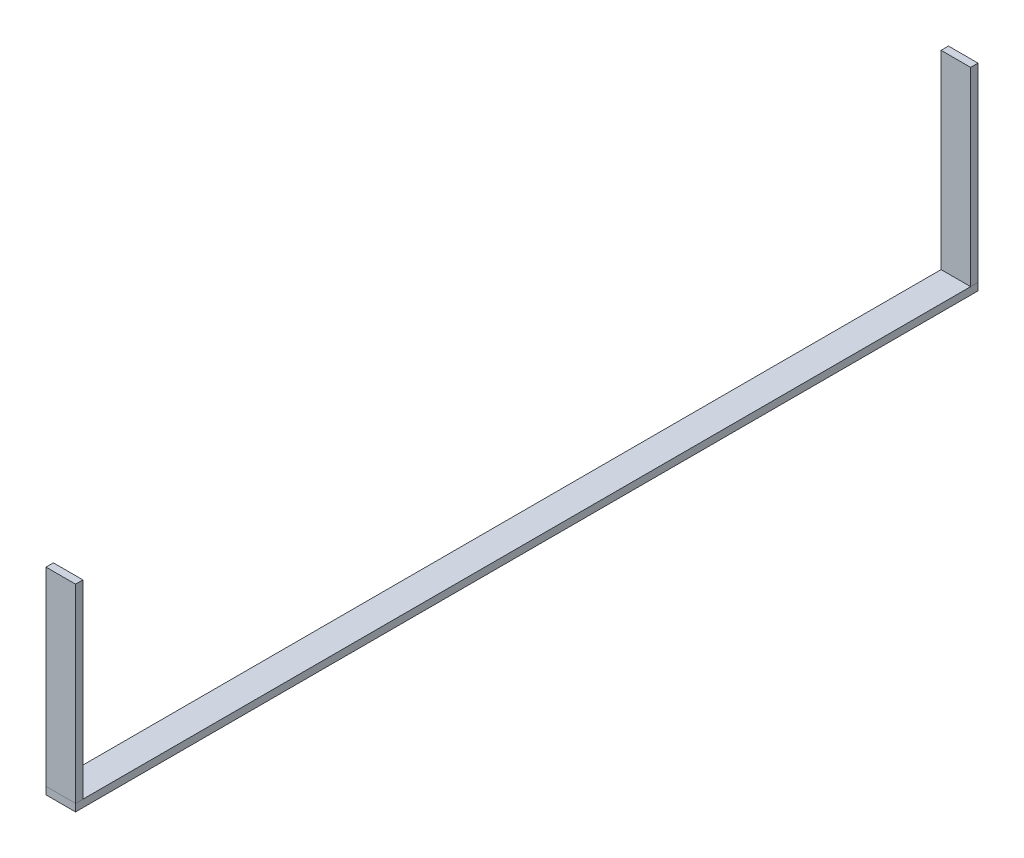
ISO-10303-21;
HEADER;
FILE_DESCRIPTION(('STEP AP214'),'2;1');
FILE_NAME('part.step','',(''),(''),'','','');
FILE_SCHEMA(('AUTOMOTIVE_DESIGN { 1 0 10303 214 1 1 1 1 }'));
ENDSEC;
DATA;
#1=APPLICATION_CONTEXT('core data for automotive mechanical design processes');
#2=APPLICATION_PROTOCOL_DEFINITION('international standard','automotive_design',2000,#1);
#3=PRODUCT_CONTEXT('',#1,'mechanical');
#4=PRODUCT('Part','Part','',(#3));
#5=PRODUCT_RELATED_PRODUCT_CATEGORY('part','',(#4));
#6=PRODUCT_DEFINITION_FORMATION('','',#4);
#7=PRODUCT_DEFINITION_CONTEXT('part definition',#1,'design');
#8=PRODUCT_DEFINITION('design','',#6,#7);
#9=PRODUCT_DEFINITION_SHAPE('','',#8);
#10=(LENGTH_UNIT() NAMED_UNIT(*) SI_UNIT(.MILLI.,.METRE.));
#11=(NAMED_UNIT(*) PLANE_ANGLE_UNIT() SI_UNIT($,.RADIAN.));
#12=(NAMED_UNIT(*) SI_UNIT($,.STERADIAN.) SOLID_ANGLE_UNIT());
#13=UNCERTAINTY_MEASURE_WITH_UNIT(LENGTH_MEASURE(1.E-05),#10,'distance_accuracy_value','');
#14=(GEOMETRIC_REPRESENTATION_CONTEXT(3) GLOBAL_UNCERTAINTY_ASSIGNED_CONTEXT((#13)) GLOBAL_UNIT_ASSIGNED_CONTEXT((#10,
#11,#12)) REPRESENTATION_CONTEXT('',''));
#15=CARTESIAN_POINT('',(0.,0.,0.));
#16=DIRECTION('',(0.,0.,1.));
#17=DIRECTION('',(1.,0.,0.));
#18=AXIS2_PLACEMENT_3D('',#15,#16,#17);
#19=CARTESIAN_POINT('',(-6.35000000000002,84.825,-194.));
#20=DIRECTION('',(1.,0.,0.));
#21=DIRECTION('',(0.,0.,-1.));
#22=AXIS2_PLACEMENT_3D('',#19,#20,#21);
#23=PLANE('',#22);
#24=DIRECTION('',(0.,0.,1.));
#25=VECTOR('',#24,1.);
#26=CARTESIAN_POINT('',(-6.35000000000002,3.175,-194.));
#27=LINE('',#26,#25);
#28=CARTESIAN_POINT('',(-6.35000000000002,3.175,-194.));
#29=VERTEX_POINT('',#28);
#30=CARTESIAN_POINT('',(-6.35000000000002,3.175,-190.825));
#31=VERTEX_POINT('',#30);
#32=EDGE_CURVE('E12',#29,#31,#27,.T.);
#33=ORIENTED_EDGE('',*,*,#32,.T.);
#34=DIRECTION('',(0.,-1.,0.));
#35=VECTOR('',#34,1.);
#36=CARTESIAN_POINT('',(-6.35000000000002,84.825,-190.825));
#37=LINE('',#36,#35);
#38=CARTESIAN_POINT('',(-6.35000000000002,84.825,-190.825));
#39=VERTEX_POINT('',#38);
#40=EDGE_CURVE('E130',#39,#31,#37,.T.);
#41=ORIENTED_EDGE('',*,*,#40,.F.);
#42=DIRECTION('',(0.,0.,1.));
#43=VECTOR('',#42,1.);
#44=CARTESIAN_POINT('',(-6.35000000000002,84.825,-194.));
#45=LINE('',#44,#43);
#46=CARTESIAN_POINT('',(-6.35000000000002,84.825,-194.));
#47=VERTEX_POINT('',#46);
#48=EDGE_CURVE('E58',#47,#39,#45,.T.);
#49=ORIENTED_EDGE('',*,*,#48,.F.);
#50=DIRECTION('',(0.,-1.,0.));
#51=VECTOR('',#50,1.);
#52=CARTESIAN_POINT('',(-6.35000000000002,84.825,-194.));
#53=LINE('',#52,#51);
#54=EDGE_CURVE('E113',#47,#29,#53,.T.);
#55=ORIENTED_EDGE('',*,*,#54,.T.);
#56=EDGE_LOOP('',(#33,#41,#49,#55));
#57=FACE_BOUND('',#56,.T.);
#58=ADVANCED_FACE('F57',(#57),#23,.F.);
#59=CARTESIAN_POINT('',(-6.35000000000002,84.825,-190.825));
#60=DIRECTION('',(0.,0.,-1.));
#61=DIRECTION('',(-1.,0.,0.));
#62=AXIS2_PLACEMENT_3D('',#59,#60,#61);
#63=PLANE('',#62);
#64=DIRECTION('',(1.,0.,0.));
#65=VECTOR('',#64,1.);
#66=CARTESIAN_POINT('',(-6.35000000000002,3.175,-190.825));
#67=LINE('',#66,#65);
#68=CARTESIAN_POINT('',(6.34999999999997,3.175,-190.825));
#69=VERTEX_POINT('',#68);
#70=EDGE_CURVE('E69',#31,#69,#67,.T.);
#71=ORIENTED_EDGE('',*,*,#70,.T.);
#72=DIRECTION('',(0.,-1.,0.));
#73=VECTOR('',#72,1.);
#74=CARTESIAN_POINT('',(6.34999999999997,84.825,-190.825));
#75=LINE('',#74,#73);
#76=CARTESIAN_POINT('',(6.34999999999997,84.825,-190.825));
#77=VERTEX_POINT('',#76);
#78=EDGE_CURVE('E112',#77,#69,#75,.T.);
#79=ORIENTED_EDGE('',*,*,#78,.F.);
#80=DIRECTION('',(1.,0.,0.));
#81=VECTOR('',#80,1.);
#82=CARTESIAN_POINT('',(-6.35000000000002,84.825,-190.825));
#83=LINE('',#82,#81);
#84=EDGE_CURVE('E89',#39,#77,#83,.T.);
#85=ORIENTED_EDGE('',*,*,#84,.F.);
#86=ORIENTED_EDGE('',*,*,#40,.T.);
#87=EDGE_LOOP('',(#71,#79,#85,#86));
#88=FACE_BOUND('',#87,.T.);
#89=ADVANCED_FACE('F128',(#88),#63,.F.);
#90=CARTESIAN_POINT('',(6.34999999999998,84.825,-194.));
#91=DIRECTION('',(-1.,0.,0.));
#92=DIRECTION('',(0.,0.,1.));
#93=AXIS2_PLACEMENT_3D('',#90,#91,#92);
#94=PLANE('',#93);
#95=DIRECTION('',(0.,0.,-1.));
#96=VECTOR('',#95,1.);
#97=CARTESIAN_POINT('',(6.34999999999998,3.175,-194.));
#98=LINE('',#97,#96);
#99=CARTESIAN_POINT('',(6.34999999999998,3.175,-194.));
#100=VERTEX_POINT('',#99);
#101=EDGE_CURVE('E106',#69,#100,#98,.T.);
#102=ORIENTED_EDGE('',*,*,#101,.T.);
#103=DIRECTION('',(0.,-1.,0.));
#104=VECTOR('',#103,1.);
#105=CARTESIAN_POINT('',(6.34999999999998,84.825,-194.));
#106=LINE('',#105,#104);
#107=CARTESIAN_POINT('',(6.34999999999998,84.825,-194.));
#108=VERTEX_POINT('',#107);
#109=EDGE_CURVE('E108',#108,#100,#106,.T.);
#110=ORIENTED_EDGE('',*,*,#109,.F.);
#111=DIRECTION('',(0.,0.,-1.));
#112=VECTOR('',#111,1.);
#113=CARTESIAN_POINT('',(6.34999999999998,84.825,-194.));
#114=LINE('',#113,#112);
#115=EDGE_CURVE('E125',#77,#108,#114,.T.);
#116=ORIENTED_EDGE('',*,*,#115,.F.);
#117=ORIENTED_EDGE('',*,*,#78,.T.);
#118=EDGE_LOOP('',(#102,#110,#116,#117));
#119=FACE_BOUND('',#118,.T.);
#120=ADVANCED_FACE('F110',(#119),#94,.F.);
#121=CARTESIAN_POINT('',(-6.35000000000002,84.825,-194.));
#122=DIRECTION('',(0.,0.,1.));
#123=DIRECTION('',(1.,0.,0.));
#124=AXIS2_PLACEMENT_3D('',#121,#122,#123);
#125=PLANE('',#124);
#126=DIRECTION('',(-1.,0.,0.));
#127=VECTOR('',#126,1.);
#128=CARTESIAN_POINT('',(-6.35000000000002,3.175,-194.));
#129=LINE('',#128,#127);
#130=EDGE_CURVE('E99',#100,#29,#129,.T.);
#131=ORIENTED_EDGE('',*,*,#130,.T.);
#132=ORIENTED_EDGE('',*,*,#54,.F.);
#133=DIRECTION('',(-1.,0.,0.));
#134=VECTOR('',#133,1.);
#135=CARTESIAN_POINT('',(-6.35000000000002,84.825,-194.));
#136=LINE('',#135,#134);
#137=EDGE_CURVE('E111',#108,#47,#136,.T.);
#138=ORIENTED_EDGE('',*,*,#137,.F.);
#139=ORIENTED_EDGE('',*,*,#109,.T.);
#140=EDGE_LOOP('',(#131,#132,#138,#139));
#141=FACE_BOUND('',#140,.T.);
#142=ADVANCED_FACE('F114',(#141),#125,.F.);
#143=CARTESIAN_POINT('',(0.,84.825,0.));
#144=DIRECTION('',(0.,1.,0.));
#145=DIRECTION('',(0.,0.,1.));
#146=AXIS2_PLACEMENT_3D('',#143,#144,#145);
#147=PLANE('',#146);
#148=ORIENTED_EDGE('',*,*,#48,.T.);
#149=ORIENTED_EDGE('',*,*,#84,.T.);
#150=ORIENTED_EDGE('',*,*,#115,.T.);
#151=ORIENTED_EDGE('',*,*,#137,.T.);
#152=EDGE_LOOP('',(#148,#149,#150,#151));
#153=FACE_BOUND('',#152,.T.);
#154=ADVANCED_FACE('F59',(#153),#147,.T.);
#155=CARTESIAN_POINT('',(0.,3.175,0.));
#156=DIRECTION('',(0.,1.,0.));
#157=DIRECTION('',(0.,0.,1.));
#158=AXIS2_PLACEMENT_3D('',#155,#156,#157);
#159=PLANE('',#158);
#160=ORIENTED_EDGE('',*,*,#32,.F.);
#161=ORIENTED_EDGE('',*,*,#130,.F.);
#162=ORIENTED_EDGE('',*,*,#101,.F.);
#163=ORIENTED_EDGE('',*,*,#70,.F.);
#164=EDGE_LOOP('',(#160,#161,#162,#163));
#165=FACE_BOUND('',#164,.T.);
#166=ADVANCED_FACE('F116',(#165),#159,.F.);
#167=CLOSED_SHELL('',(#58,#89,#120,#142,#154,#166));
#168=MANIFOLD_SOLID_BREP('B2',#167);
#169=CARTESIAN_POINT('',(6.35000000000002,84.825,194.));
#170=DIRECTION('',(-1.,0.,0.));
#171=DIRECTION('',(0.,0.,1.));
#172=AXIS2_PLACEMENT_3D('',#169,#170,#171);
#173=PLANE('',#172);
#174=DIRECTION('',(0.,0.,-1.));
#175=VECTOR('',#174,1.);
#176=CARTESIAN_POINT('',(6.35000000000002,3.175,194.));
#177=LINE('',#176,#175);
#178=CARTESIAN_POINT('',(6.35000000000002,3.175,194.));
#179=VERTEX_POINT('',#178);
#180=CARTESIAN_POINT('',(6.35000000000002,3.175,190.825));
#181=VERTEX_POINT('',#180);
#182=EDGE_CURVE('E252',#179,#181,#177,.T.);
#183=ORIENTED_EDGE('',*,*,#182,.T.);
#184=DIRECTION('',(0.,-1.,0.));
#185=VECTOR('',#184,1.);
#186=CARTESIAN_POINT('',(6.35000000000002,84.825,190.825));
#187=LINE('',#186,#185);
#188=CARTESIAN_POINT('',(6.35000000000002,84.825,190.825));
#189=VERTEX_POINT('',#188);
#190=EDGE_CURVE('E53',#189,#181,#187,.T.);
#191=ORIENTED_EDGE('',*,*,#190,.F.);
#192=DIRECTION('',(0.,0.,-1.));
#193=VECTOR('',#192,1.);
#194=CARTESIAN_POINT('',(6.35000000000002,84.825,194.));
#195=LINE('',#194,#193);
#196=CARTESIAN_POINT('',(6.35000000000002,84.825,194.));
#197=VERTEX_POINT('',#196);
#198=EDGE_CURVE('E238',#197,#189,#195,.T.);
#199=ORIENTED_EDGE('',*,*,#198,.F.);
#200=DIRECTION('',(0.,-1.,0.));
#201=VECTOR('',#200,1.);
#202=CARTESIAN_POINT('',(6.35000000000002,84.825,194.));
#203=LINE('',#202,#201);
#204=EDGE_CURVE('E250',#197,#179,#203,.T.);
#205=ORIENTED_EDGE('',*,*,#204,.T.);
#206=EDGE_LOOP('',(#183,#191,#199,#205));
#207=FACE_BOUND('',#206,.T.);
#208=ADVANCED_FACE('F188',(#207),#173,.F.);
#209=CARTESIAN_POINT('',(6.35000000000002,84.825,190.825));
#210=DIRECTION('',(0.,0.,1.));
#211=DIRECTION('',(1.,0.,0.));
#212=AXIS2_PLACEMENT_3D('',#209,#210,#211);
#213=PLANE('',#212);
#214=DIRECTION('',(-1.,0.,0.));
#215=VECTOR('',#214,1.);
#216=CARTESIAN_POINT('',(6.35000000000002,3.175,190.825));
#217=LINE('',#216,#215);
#218=CARTESIAN_POINT('',(-6.35000000000002,3.175,190.825));
#219=VERTEX_POINT('',#218);
#220=EDGE_CURVE('E243',#181,#219,#217,.T.);
#221=ORIENTED_EDGE('',*,*,#220,.T.);
#222=DIRECTION('',(0.,-1.,0.));
#223=VECTOR('',#222,1.);
#224=CARTESIAN_POINT('',(-6.35000000000002,84.825,190.825));
#225=LINE('',#224,#223);
#226=CARTESIAN_POINT('',(-6.35000000000002,84.825,190.825));
#227=VERTEX_POINT('',#226);
#228=EDGE_CURVE('E197',#227,#219,#225,.T.);
#229=ORIENTED_EDGE('',*,*,#228,.F.);
#230=DIRECTION('',(-1.,0.,0.));
#231=VECTOR('',#230,1.);
#232=CARTESIAN_POINT('',(6.35000000000002,84.825,190.825));
#233=LINE('',#232,#231);
#234=EDGE_CURVE('E232',#189,#227,#233,.T.);
#235=ORIENTED_EDGE('',*,*,#234,.F.);
#236=ORIENTED_EDGE('',*,*,#190,.T.);
#237=EDGE_LOOP('',(#221,#229,#235,#236));
#238=FACE_BOUND('',#237,.T.);
#239=ADVANCED_FACE('F245',(#238),#213,.F.);
#240=CARTESIAN_POINT('',(-6.34999999999998,84.825,194.));
#241=DIRECTION('',(1.,0.,0.));
#242=DIRECTION('',(0.,0.,-1.));
#243=AXIS2_PLACEMENT_3D('',#240,#241,#242);
#244=PLANE('',#243);
#245=DIRECTION('',(0.,0.,1.));
#246=VECTOR('',#245,1.);
#247=CARTESIAN_POINT('',(-6.34999999999998,3.175,194.));
#248=LINE('',#247,#246);
#249=CARTESIAN_POINT('',(-6.34999999999998,3.175,194.));
#250=VERTEX_POINT('',#249);
#251=EDGE_CURVE('E225',#219,#250,#248,.T.);
#252=ORIENTED_EDGE('',*,*,#251,.T.);
#253=DIRECTION('',(0.,-1.,0.));
#254=VECTOR('',#253,1.);
#255=CARTESIAN_POINT('',(-6.34999999999998,84.825,194.));
#256=LINE('',#255,#254);
#257=CARTESIAN_POINT('',(-6.34999999999998,84.825,194.));
#258=VERTEX_POINT('',#257);
#259=EDGE_CURVE('E242',#258,#250,#256,.T.);
#260=ORIENTED_EDGE('',*,*,#259,.F.);
#261=DIRECTION('',(0.,0.,1.));
#262=VECTOR('',#261,1.);
#263=CARTESIAN_POINT('',(-6.34999999999998,84.825,194.));
#264=LINE('',#263,#262);
#265=EDGE_CURVE('E236',#227,#258,#264,.T.);
#266=ORIENTED_EDGE('',*,*,#265,.F.);
#267=ORIENTED_EDGE('',*,*,#228,.T.);
#268=EDGE_LOOP('',(#252,#260,#266,#267));
#269=FACE_BOUND('',#268,.T.);
#270=ADVANCED_FACE('F249',(#269),#244,.F.);
#271=CARTESIAN_POINT('',(6.35000000000002,84.825,194.));
#272=DIRECTION('',(0.,0.,-1.));
#273=DIRECTION('',(-1.,0.,0.));
#274=AXIS2_PLACEMENT_3D('',#271,#272,#273);
#275=PLANE('',#274);
#276=DIRECTION('',(1.,0.,0.));
#277=VECTOR('',#276,1.);
#278=CARTESIAN_POINT('',(6.35000000000002,3.175,194.));
#279=LINE('',#278,#277);
#280=EDGE_CURVE('E230',#250,#179,#279,.T.);
#281=ORIENTED_EDGE('',*,*,#280,.T.);
#282=ORIENTED_EDGE('',*,*,#204,.F.);
#283=DIRECTION('',(1.,0.,0.));
#284=VECTOR('',#283,1.);
#285=CARTESIAN_POINT('',(6.35000000000002,84.825,194.));
#286=LINE('',#285,#284);
#287=EDGE_CURVE('E202',#258,#197,#286,.T.);
#288=ORIENTED_EDGE('',*,*,#287,.F.);
#289=ORIENTED_EDGE('',*,*,#259,.T.);
#290=EDGE_LOOP('',(#281,#282,#288,#289));
#291=FACE_BOUND('',#290,.T.);
#292=ADVANCED_FACE('F259',(#291),#275,.F.);
#293=CARTESIAN_POINT('',(0.,84.825,0.));
#294=DIRECTION('',(0.,1.,0.));
#295=DIRECTION('',(0.,0.,1.));
#296=AXIS2_PLACEMENT_3D('',#293,#294,#295);
#297=PLANE('',#296);
#298=ORIENTED_EDGE('',*,*,#198,.T.);
#299=ORIENTED_EDGE('',*,*,#234,.T.);
#300=ORIENTED_EDGE('',*,*,#265,.T.);
#301=ORIENTED_EDGE('',*,*,#287,.T.);
#302=EDGE_LOOP('',(#298,#299,#300,#301));
#303=FACE_BOUND('',#302,.T.);
#304=ADVANCED_FACE('F237',(#303),#297,.T.);
#305=CARTESIAN_POINT('',(0.,3.175,0.));
#306=DIRECTION('',(0.,1.,0.));
#307=DIRECTION('',(0.,0.,1.));
#308=AXIS2_PLACEMENT_3D('',#305,#306,#307);
#309=PLANE('',#308);
#310=ORIENTED_EDGE('',*,*,#182,.F.);
#311=ORIENTED_EDGE('',*,*,#280,.F.);
#312=ORIENTED_EDGE('',*,*,#251,.F.);
#313=ORIENTED_EDGE('',*,*,#220,.F.);
#314=EDGE_LOOP('',(#310,#311,#312,#313));
#315=FACE_BOUND('',#314,.T.);
#316=ADVANCED_FACE('F265',(#315),#309,.F.);
#317=CLOSED_SHELL('',(#208,#239,#270,#292,#304,#316));
#318=MANIFOLD_SOLID_BREP('B6',#317);
#319=CARTESIAN_POINT('',(-6.35000000000002,3.175,-194.));
#320=DIRECTION('',(0.,0.,-1.));
#321=DIRECTION('',(-1.,0.,0.));
#322=AXIS2_PLACEMENT_3D('',#319,#320,#321);
#323=PLANE('',#322);
#324=DIRECTION('',(1.,0.,0.));
#325=VECTOR('',#324,1.);
#326=CARTESIAN_POINT('',(-6.35000000000002,0.,-194.));
#327=LINE('',#326,#325);
#328=CARTESIAN_POINT('',(-6.35000000000002,0.,-194.));
#329=VERTEX_POINT('',#328);
#330=CARTESIAN_POINT('',(6.34999999999997,0.,-194.));
#331=VERTEX_POINT('',#330);
#332=EDGE_CURVE('E382',#329,#331,#327,.T.);
#333=ORIENTED_EDGE('',*,*,#332,.F.);
#334=DIRECTION('',(0.,-1.,0.));
#335=VECTOR('',#334,1.);
#336=CARTESIAN_POINT('',(-6.35000000000002,3.175,-194.));
#337=LINE('',#336,#335);
#338=CARTESIAN_POINT('',(-6.35000000000002,3.175,-194.));
#339=VERTEX_POINT('',#338);
#340=EDGE_CURVE('E186',#339,#329,#337,.T.);
#341=ORIENTED_EDGE('',*,*,#340,.F.);
#342=DIRECTION('',(1.,0.,0.));
#343=VECTOR('',#342,1.);
#344=CARTESIAN_POINT('',(-6.35000000000002,3.175,-194.));
#345=LINE('',#344,#343);
#346=CARTESIAN_POINT('',(6.34999999999997,3.175,-194.));
#347=VERTEX_POINT('',#346);
#348=EDGE_CURVE('E376',#339,#347,#345,.T.);
#349=ORIENTED_EDGE('',*,*,#348,.T.);
#350=DIRECTION('',(0.,-1.,0.));
#351=VECTOR('',#350,1.);
#352=CARTESIAN_POINT('',(6.34999999999997,3.175,-194.));
#353=LINE('',#352,#351);
#354=EDGE_CURVE('E312',#347,#331,#353,.T.);
#355=ORIENTED_EDGE('',*,*,#354,.T.);
#356=EDGE_LOOP('',(#333,#341,#349,#355));
#357=FACE_BOUND('',#356,.T.);
#358=ADVANCED_FACE('F315',(#357),#323,.T.);
#359=CARTESIAN_POINT('',(-6.35000000000002,3.175,-194.));
#360=DIRECTION('',(1.,0.,0.));
#361=DIRECTION('',(0.,0.,-1.));
#362=AXIS2_PLACEMENT_3D('',#359,#360,#361);
#363=PLANE('',#362);
#364=DIRECTION('',(0.,0.,1.));
#365=VECTOR('',#364,1.);
#366=CARTESIAN_POINT('',(-6.35000000000002,0.,-194.));
#367=LINE('',#366,#365);
#368=CARTESIAN_POINT('',(-6.34999999999998,0.,194.));
#369=VERTEX_POINT('',#368);
#370=EDGE_CURVE('E347',#329,#369,#367,.T.);
#371=ORIENTED_EDGE('',*,*,#370,.T.);
#372=DIRECTION('',(0.,-1.,0.));
#373=VECTOR('',#372,1.);
#374=CARTESIAN_POINT('',(-6.34999999999998,3.175,194.));
#375=LINE('',#374,#373);
#376=CARTESIAN_POINT('',(-6.34999999999998,3.175,194.));
#377=VERTEX_POINT('',#376);
#378=EDGE_CURVE('E325',#377,#369,#375,.T.);
#379=ORIENTED_EDGE('',*,*,#378,.F.);
#380=DIRECTION('',(0.,0.,1.));
#381=VECTOR('',#380,1.);
#382=CARTESIAN_POINT('',(-6.35000000000002,3.175,-194.));
#383=LINE('',#382,#381);
#384=EDGE_CURVE('E361',#339,#377,#383,.T.);
#385=ORIENTED_EDGE('',*,*,#384,.F.);
#386=ORIENTED_EDGE('',*,*,#340,.T.);
#387=EDGE_LOOP('',(#371,#379,#385,#386));
#388=FACE_BOUND('',#387,.T.);
#389=ADVANCED_FACE('F398',(#388),#363,.F.);
#390=CARTESIAN_POINT('',(-6.34999999999998,3.175,194.));
#391=DIRECTION('',(0.,0.,-1.));
#392=DIRECTION('',(-1.,0.,0.));
#393=AXIS2_PLACEMENT_3D('',#390,#391,#392);
#394=PLANE('',#393);
#395=DIRECTION('',(1.,0.,0.));
#396=VECTOR('',#395,1.);
#397=CARTESIAN_POINT('',(-6.34999999999998,0.,194.));
#398=LINE('',#397,#396);
#399=CARTESIAN_POINT('',(6.35000000000002,0.,194.));
#400=VERTEX_POINT('',#399);
#401=EDGE_CURVE('E371',#369,#400,#398,.T.);
#402=ORIENTED_EDGE('',*,*,#401,.T.);
#403=DIRECTION('',(0.,-1.,0.));
#404=VECTOR('',#403,1.);
#405=CARTESIAN_POINT('',(6.35000000000002,3.175,194.));
#406=LINE('',#405,#404);
#407=CARTESIAN_POINT('',(6.35000000000002,3.175,194.));
#408=VERTEX_POINT('',#407);
#409=EDGE_CURVE('E366',#408,#400,#406,.T.);
#410=ORIENTED_EDGE('',*,*,#409,.F.);
#411=DIRECTION('',(1.,0.,0.));
#412=VECTOR('',#411,1.);
#413=CARTESIAN_POINT('',(-6.34999999999998,3.175,194.));
#414=LINE('',#413,#412);
#415=EDGE_CURVE('E360',#377,#408,#414,.T.);
#416=ORIENTED_EDGE('',*,*,#415,.F.);
#417=ORIENTED_EDGE('',*,*,#378,.T.);
#418=EDGE_LOOP('',(#402,#410,#416,#417));
#419=FACE_BOUND('',#418,.T.);
#420=ADVANCED_FACE('F369',(#419),#394,.F.);
#421=CARTESIAN_POINT('',(6.34999999999997,3.175,-194.));
#422=DIRECTION('',(1.,0.,0.));
#423=DIRECTION('',(0.,0.,-1.));
#424=AXIS2_PLACEMENT_3D('',#421,#422,#423);
#425=PLANE('',#424);
#426=DIRECTION('',(0.,0.,1.));
#427=VECTOR('',#426,1.);
#428=CARTESIAN_POINT('',(6.34999999999997,0.,-194.));
#429=LINE('',#428,#427);
#430=EDGE_CURVE('E390',#331,#400,#429,.T.);
#431=ORIENTED_EDGE('',*,*,#430,.F.);
#432=ORIENTED_EDGE('',*,*,#354,.F.);
#433=DIRECTION('',(0.,0.,1.));
#434=VECTOR('',#433,1.);
#435=CARTESIAN_POINT('',(6.34999999999997,3.175,-194.));
#436=LINE('',#435,#434);
#437=EDGE_CURVE('E362',#347,#408,#436,.T.);
#438=ORIENTED_EDGE('',*,*,#437,.T.);
#439=ORIENTED_EDGE('',*,*,#409,.T.);
#440=EDGE_LOOP('',(#431,#432,#438,#439));
#441=FACE_BOUND('',#440,.T.);
#442=ADVANCED_FACE('F372',(#441),#425,.T.);
#443=CARTESIAN_POINT('',(0.,3.175,0.));
#444=DIRECTION('',(0.,-1.,0.));
#445=DIRECTION('',(0.,0.,-1.));
#446=AXIS2_PLACEMENT_3D('',#443,#444,#445);
#447=PLANE('',#446);
#448=ORIENTED_EDGE('',*,*,#348,.F.);
#449=ORIENTED_EDGE('',*,*,#384,.T.);
#450=ORIENTED_EDGE('',*,*,#415,.T.);
#451=ORIENTED_EDGE('',*,*,#437,.F.);
#452=EDGE_LOOP('',(#448,#449,#450,#451));
#453=FACE_BOUND('',#452,.T.);
#454=ADVANCED_FACE('F363',(#453),#447,.F.);
#455=CARTESIAN_POINT('',(0.,0.,0.));
#456=DIRECTION('',(0.,-1.,0.));
#457=DIRECTION('',(0.,0.,-1.));
#458=AXIS2_PLACEMENT_3D('',#455,#456,#457);
#459=PLANE('',#458);
#460=ORIENTED_EDGE('',*,*,#332,.T.);
#461=ORIENTED_EDGE('',*,*,#430,.T.);
#462=ORIENTED_EDGE('',*,*,#401,.F.);
#463=ORIENTED_EDGE('',*,*,#370,.F.);
#464=EDGE_LOOP('',(#460,#461,#462,#463));
#465=FACE_BOUND('',#464,.T.);
#466=ADVANCED_FACE('F399',(#465),#459,.T.);
#467=CLOSED_SHELL('',(#358,#389,#420,#442,#454,#466));
#468=MANIFOLD_SOLID_BREP('B48',#467);
#469=ADVANCED_BREP_SHAPE_REPRESENTATION('',(#18,#168,#318,#468),#14);
#470=SHAPE_DEFINITION_REPRESENTATION(#9,#469);
ENDSEC;
END-ISO-10303-21;
